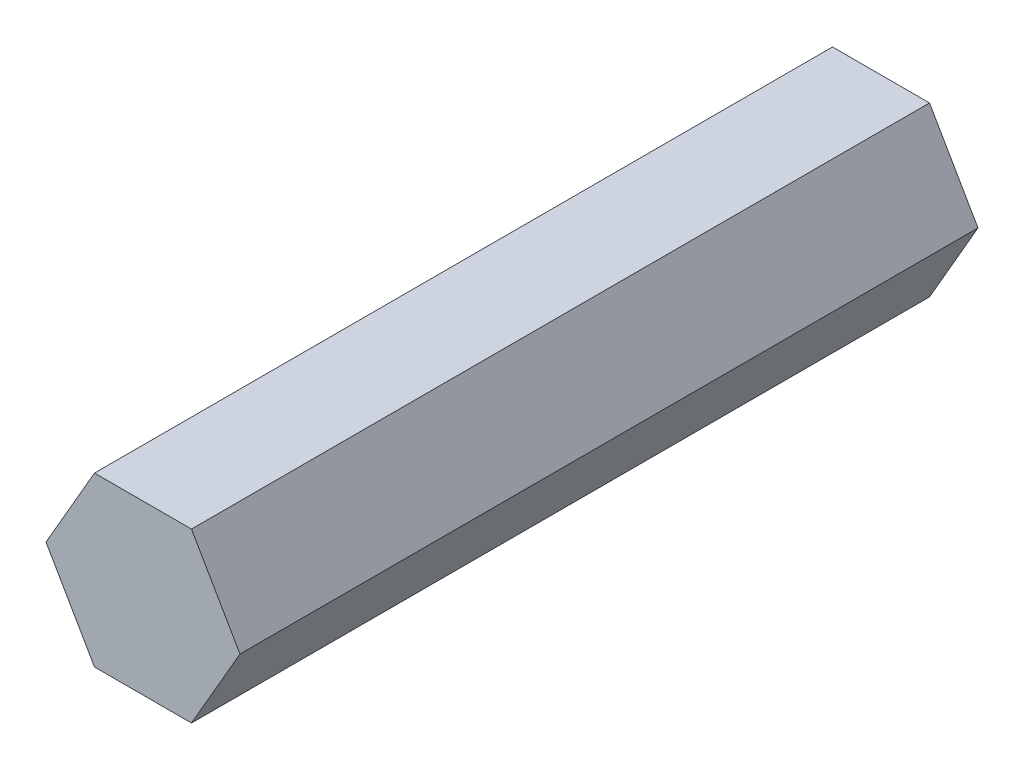
ISO-10303-21;
HEADER;
FILE_DESCRIPTION(('STEP AP214'),'2;1');
FILE_NAME('part.step','',(''),(''),'','','');
FILE_SCHEMA(('AUTOMOTIVE_DESIGN { 1 0 10303 214 1 1 1 1 }'));
ENDSEC;
DATA;
#1=APPLICATION_CONTEXT('core data for automotive mechanical design processes');
#2=APPLICATION_PROTOCOL_DEFINITION('international standard','automotive_design',2000,#1);
#3=PRODUCT_CONTEXT('',#1,'mechanical');
#4=PRODUCT('Part','Part','',(#3));
#5=PRODUCT_RELATED_PRODUCT_CATEGORY('part','',(#4));
#6=PRODUCT_DEFINITION_FORMATION('','',#4);
#7=PRODUCT_DEFINITION_CONTEXT('part definition',#1,'design');
#8=PRODUCT_DEFINITION('design','',#6,#7);
#9=PRODUCT_DEFINITION_SHAPE('','',#8);
#10=(LENGTH_UNIT() NAMED_UNIT(*) SI_UNIT(.MILLI.,.METRE.));
#11=(NAMED_UNIT(*) PLANE_ANGLE_UNIT() SI_UNIT($,.RADIAN.));
#12=(NAMED_UNIT(*) SI_UNIT($,.STERADIAN.) SOLID_ANGLE_UNIT());
#13=UNCERTAINTY_MEASURE_WITH_UNIT(LENGTH_MEASURE(1.E-05),#10,'distance_accuracy_value','');
#14=(GEOMETRIC_REPRESENTATION_CONTEXT(3) GLOBAL_UNCERTAINTY_ASSIGNED_CONTEXT((#13)) GLOBAL_UNIT_ASSIGNED_CONTEXT((#10,
#11,#12)) REPRESENTATION_CONTEXT('',''));
#15=CARTESIAN_POINT('',(0.,0.,0.));
#16=DIRECTION('',(0.,0.,1.));
#17=DIRECTION('',(1.,0.,0.));
#18=AXIS2_PLACEMENT_3D('',#15,#16,#17);
#19=CARTESIAN_POINT('',(0.499407982849026,-0.865,7.6));
#20=DIRECTION('',(-0.866025403784439,0.5,0.));
#21=DIRECTION('',(-0.5,-0.866025403784439,0.));
#22=AXIS2_PLACEMENT_3D('',#19,#20,#21);
#23=PLANE('',#22);
#24=DIRECTION('',(0.5,0.866025403784439,0.));
#25=VECTOR('',#24,1.);
#26=CARTESIAN_POINT('',(0.499407982849026,-0.865,0.));
#27=LINE('',#26,#25);
#28=CARTESIAN_POINT('',(0.499407982849026,-0.865,0.));
#29=VERTEX_POINT('',#28);
#30=CARTESIAN_POINT('',(0.998815965698053,0.,0.));
#31=VERTEX_POINT('',#30);
#32=EDGE_CURVE('E121',#29,#31,#27,.T.);
#33=ORIENTED_EDGE('',*,*,#32,.T.);
#34=DIRECTION('',(0.,0.,-1.));
#35=VECTOR('',#34,1.);
#36=CARTESIAN_POINT('',(0.998815965698053,0.,7.6));
#37=LINE('',#36,#35);
#38=CARTESIAN_POINT('',(0.998815965698053,0.,7.6));
#39=VERTEX_POINT('',#38);
#40=EDGE_CURVE('E11',#39,#31,#37,.T.);
#41=ORIENTED_EDGE('',*,*,#40,.F.);
#42=DIRECTION('',(0.5,0.866025403784439,0.));
#43=VECTOR('',#42,1.);
#44=CARTESIAN_POINT('',(0.499407982849026,-0.865,7.6));
#45=LINE('',#44,#43);
#46=CARTESIAN_POINT('',(0.499407982849026,-0.865,7.6));
#47=VERTEX_POINT('',#46);
#48=EDGE_CURVE('E131',#47,#39,#45,.T.);
#49=ORIENTED_EDGE('',*,*,#48,.F.);
#50=DIRECTION('',(0.,0.,-1.));
#51=VECTOR('',#50,1.);
#52=CARTESIAN_POINT('',(0.499407982849026,-0.865,7.6));
#53=LINE('',#52,#51);
#54=EDGE_CURVE('E117',#47,#29,#53,.T.);
#55=ORIENTED_EDGE('',*,*,#54,.T.);
#56=EDGE_LOOP('',(#33,#41,#49,#55));
#57=FACE_BOUND('',#56,.T.);
#58=ADVANCED_FACE('F37',(#57),#23,.F.);
#59=CARTESIAN_POINT('',(0.998815965698053,0.,7.6));
#60=DIRECTION('',(-0.866025403784439,-0.5,0.));
#61=DIRECTION('',(0.5,-0.866025403784439,0.));
#62=AXIS2_PLACEMENT_3D('',#59,#60,#61);
#63=PLANE('',#62);
#64=DIRECTION('',(-0.5,0.866025403784439,0.));
#65=VECTOR('',#64,1.);
#66=CARTESIAN_POINT('',(0.998815965698053,0.,0.));
#67=LINE('',#66,#65);
#68=CARTESIAN_POINT('',(0.499407982849027,0.865,0.));
#69=VERTEX_POINT('',#68);
#70=EDGE_CURVE('E124',#31,#69,#67,.T.);
#71=ORIENTED_EDGE('',*,*,#70,.T.);
#72=DIRECTION('',(0.,0.,-1.));
#73=VECTOR('',#72,1.);
#74=CARTESIAN_POINT('',(0.499407982849027,0.865,7.6));
#75=LINE('',#74,#73);
#76=CARTESIAN_POINT('',(0.499407982849027,0.865,7.6));
#77=VERTEX_POINT('',#76);
#78=EDGE_CURVE('E45',#77,#69,#75,.T.);
#79=ORIENTED_EDGE('',*,*,#78,.F.);
#80=DIRECTION('',(-0.5,0.866025403784439,0.));
#81=VECTOR('',#80,1.);
#82=CARTESIAN_POINT('',(0.998815965698053,0.,7.6));
#83=LINE('',#82,#81);
#84=EDGE_CURVE('E90',#39,#77,#83,.T.);
#85=ORIENTED_EDGE('',*,*,#84,.F.);
#86=ORIENTED_EDGE('',*,*,#40,.T.);
#87=EDGE_LOOP('',(#71,#79,#85,#86));
#88=FACE_BOUND('',#87,.T.);
#89=ADVANCED_FACE('F155',(#88),#63,.F.);
#90=CARTESIAN_POINT('',(0.499407982849027,0.865,7.6));
#91=DIRECTION('',(0.,-1.,0.));
#92=DIRECTION('',(1.,0.,0.));
#93=AXIS2_PLACEMENT_3D('',#90,#91,#92);
#94=PLANE('',#93);
#95=DIRECTION('',(-1.,0.,0.));
#96=VECTOR('',#95,1.);
#97=CARTESIAN_POINT('',(0.499407982849027,0.865,0.));
#98=LINE('',#97,#96);
#99=CARTESIAN_POINT('',(-0.499407982849026,0.865,0.));
#100=VERTEX_POINT('',#99);
#101=EDGE_CURVE('E126',#69,#100,#98,.T.);
#102=ORIENTED_EDGE('',*,*,#101,.T.);
#103=DIRECTION('',(0.,0.,-1.));
#104=VECTOR('',#103,1.);
#105=CARTESIAN_POINT('',(-0.499407982849026,0.865,7.6));
#106=LINE('',#105,#104);
#107=CARTESIAN_POINT('',(-0.499407982849026,0.865,7.6));
#108=VERTEX_POINT('',#107);
#109=EDGE_CURVE('E112',#108,#100,#106,.T.);
#110=ORIENTED_EDGE('',*,*,#109,.F.);
#111=DIRECTION('',(-1.,0.,0.));
#112=VECTOR('',#111,1.);
#113=CARTESIAN_POINT('',(0.499407982849027,0.865,7.6));
#114=LINE('',#113,#112);
#115=EDGE_CURVE('E103',#77,#108,#114,.T.);
#116=ORIENTED_EDGE('',*,*,#115,.F.);
#117=ORIENTED_EDGE('',*,*,#78,.T.);
#118=EDGE_LOOP('',(#102,#110,#116,#117));
#119=FACE_BOUND('',#118,.T.);
#120=ADVANCED_FACE('F137',(#119),#94,.F.);
#121=CARTESIAN_POINT('',(-0.499407982849026,0.865,7.6));
#122=DIRECTION('',(0.866025403784439,-0.5,0.));
#123=DIRECTION('',(0.5,0.866025403784439,0.));
#124=AXIS2_PLACEMENT_3D('',#121,#122,#123);
#125=PLANE('',#124);
#126=DIRECTION('',(-0.5,-0.866025403784438,0.));
#127=VECTOR('',#126,1.);
#128=CARTESIAN_POINT('',(-0.499407982849026,0.865,0.));
#129=LINE('',#128,#127);
#130=CARTESIAN_POINT('',(-0.998815965698053,0.,0.));
#131=VERTEX_POINT('',#130);
#132=EDGE_CURVE('E111',#100,#131,#129,.T.);
#133=ORIENTED_EDGE('',*,*,#132,.T.);
#134=DIRECTION('',(0.,0.,-1.));
#135=VECTOR('',#134,1.);
#136=CARTESIAN_POINT('',(-0.998815965698053,0.,7.6));
#137=LINE('',#136,#135);
#138=CARTESIAN_POINT('',(-0.998815965698053,0.,7.6));
#139=VERTEX_POINT('',#138);
#140=EDGE_CURVE('E108',#139,#131,#137,.T.);
#141=ORIENTED_EDGE('',*,*,#140,.F.);
#142=DIRECTION('',(-0.5,-0.866025403784438,0.));
#143=VECTOR('',#142,1.);
#144=CARTESIAN_POINT('',(-0.499407982849026,0.865,7.6));
#145=LINE('',#144,#143);
#146=EDGE_CURVE('E97',#108,#139,#145,.T.);
#147=ORIENTED_EDGE('',*,*,#146,.F.);
#148=ORIENTED_EDGE('',*,*,#109,.T.);
#149=EDGE_LOOP('',(#133,#141,#147,#148));
#150=FACE_BOUND('',#149,.T.);
#151=ADVANCED_FACE('F109',(#150),#125,.F.);
#152=CARTESIAN_POINT('',(-0.998815965698053,0.,7.6));
#153=DIRECTION('',(0.866025403784439,0.5,0.));
#154=DIRECTION('',(-0.5,0.866025403784439,0.));
#155=AXIS2_PLACEMENT_3D('',#152,#153,#154);
#156=PLANE('',#155);
#157=DIRECTION('',(0.5,-0.866025403784439,0.));
#158=VECTOR('',#157,1.);
#159=CARTESIAN_POINT('',(-0.998815965698053,0.,0.));
#160=LINE('',#159,#158);
#161=CARTESIAN_POINT('',(-0.499407982849027,-0.865,0.));
#162=VERTEX_POINT('',#161);
#163=EDGE_CURVE('E76',#131,#162,#160,.T.);
#164=ORIENTED_EDGE('',*,*,#163,.T.);
#165=DIRECTION('',(0.,0.,-1.));
#166=VECTOR('',#165,1.);
#167=CARTESIAN_POINT('',(-0.499407982849027,-0.865,7.6));
#168=LINE('',#167,#166);
#169=CARTESIAN_POINT('',(-0.499407982849027,-0.865,7.6));
#170=VERTEX_POINT('',#169);
#171=EDGE_CURVE('E113',#170,#162,#168,.T.);
#172=ORIENTED_EDGE('',*,*,#171,.F.);
#173=DIRECTION('',(0.5,-0.866025403784439,0.));
#174=VECTOR('',#173,1.);
#175=CARTESIAN_POINT('',(-0.998815965698053,0.,7.6));
#176=LINE('',#175,#174);
#177=EDGE_CURVE('E101',#139,#170,#176,.T.);
#178=ORIENTED_EDGE('',*,*,#177,.F.);
#179=ORIENTED_EDGE('',*,*,#140,.T.);
#180=EDGE_LOOP('',(#164,#172,#178,#179));
#181=FACE_BOUND('',#180,.T.);
#182=ADVANCED_FACE('F115',(#181),#156,.F.);
#183=CARTESIAN_POINT('',(-0.499407982849027,-0.865,7.6));
#184=DIRECTION('',(0.,1.,0.));
#185=DIRECTION('',(0.,0.,1.));
#186=AXIS2_PLACEMENT_3D('',#183,#184,#185);
#187=PLANE('',#186);
#188=DIRECTION('',(1.,0.,0.));
#189=VECTOR('',#188,1.);
#190=CARTESIAN_POINT('',(-0.499407982849027,-0.865,0.));
#191=LINE('',#190,#189);
#192=EDGE_CURVE('E82',#162,#29,#191,.T.);
#193=ORIENTED_EDGE('',*,*,#192,.T.);
#194=ORIENTED_EDGE('',*,*,#54,.F.);
#195=DIRECTION('',(1.,0.,0.));
#196=VECTOR('',#195,1.);
#197=CARTESIAN_POINT('',(-0.499407982849027,-0.865,7.6));
#198=LINE('',#197,#196);
#199=EDGE_CURVE('E53',#170,#47,#198,.T.);
#200=ORIENTED_EDGE('',*,*,#199,.F.);
#201=ORIENTED_EDGE('',*,*,#171,.T.);
#202=EDGE_LOOP('',(#193,#194,#200,#201));
#203=FACE_BOUND('',#202,.T.);
#204=ADVANCED_FACE('F144',(#203),#187,.F.);
#205=CARTESIAN_POINT('',(0.,0.,7.6));
#206=DIRECTION('',(0.,0.,1.));
#207=DIRECTION('',(1.,0.,0.));
#208=AXIS2_PLACEMENT_3D('',#205,#206,#207);
#209=PLANE('',#208);
#210=ORIENTED_EDGE('',*,*,#48,.T.);
#211=ORIENTED_EDGE('',*,*,#84,.T.);
#212=ORIENTED_EDGE('',*,*,#115,.T.);
#213=ORIENTED_EDGE('',*,*,#146,.T.);
#214=ORIENTED_EDGE('',*,*,#177,.T.);
#215=ORIENTED_EDGE('',*,*,#199,.T.);
#216=EDGE_LOOP('',(#210,#211,#212,#213,#214,#215));
#217=FACE_BOUND('',#216,.T.);
#218=ADVANCED_FACE('F99',(#217),#209,.T.);
#219=CARTESIAN_POINT('',(0.,0.,0.));
#220=DIRECTION('',(0.,0.,1.));
#221=DIRECTION('',(1.,0.,0.));
#222=AXIS2_PLACEMENT_3D('',#219,#220,#221);
#223=PLANE('',#222);
#224=ORIENTED_EDGE('',*,*,#32,.F.);
#225=ORIENTED_EDGE('',*,*,#192,.F.);
#226=ORIENTED_EDGE('',*,*,#163,.F.);
#227=ORIENTED_EDGE('',*,*,#132,.F.);
#228=ORIENTED_EDGE('',*,*,#101,.F.);
#229=ORIENTED_EDGE('',*,*,#70,.F.);
#230=EDGE_LOOP('',(#224,#225,#226,#227,#228,#229));
#231=FACE_BOUND('',#230,.T.);
#232=ADVANCED_FACE('F140',(#231),#223,.F.);
#233=CLOSED_SHELL('',(#58,#89,#120,#151,#182,#204,#218,#232));
#234=MANIFOLD_SOLID_BREP('B2',#233);
#235=ADVANCED_BREP_SHAPE_REPRESENTATION('',(#18,#234),#14);
#236=SHAPE_DEFINITION_REPRESENTATION(#9,#235);
ENDSEC;
END-ISO-10303-21;
